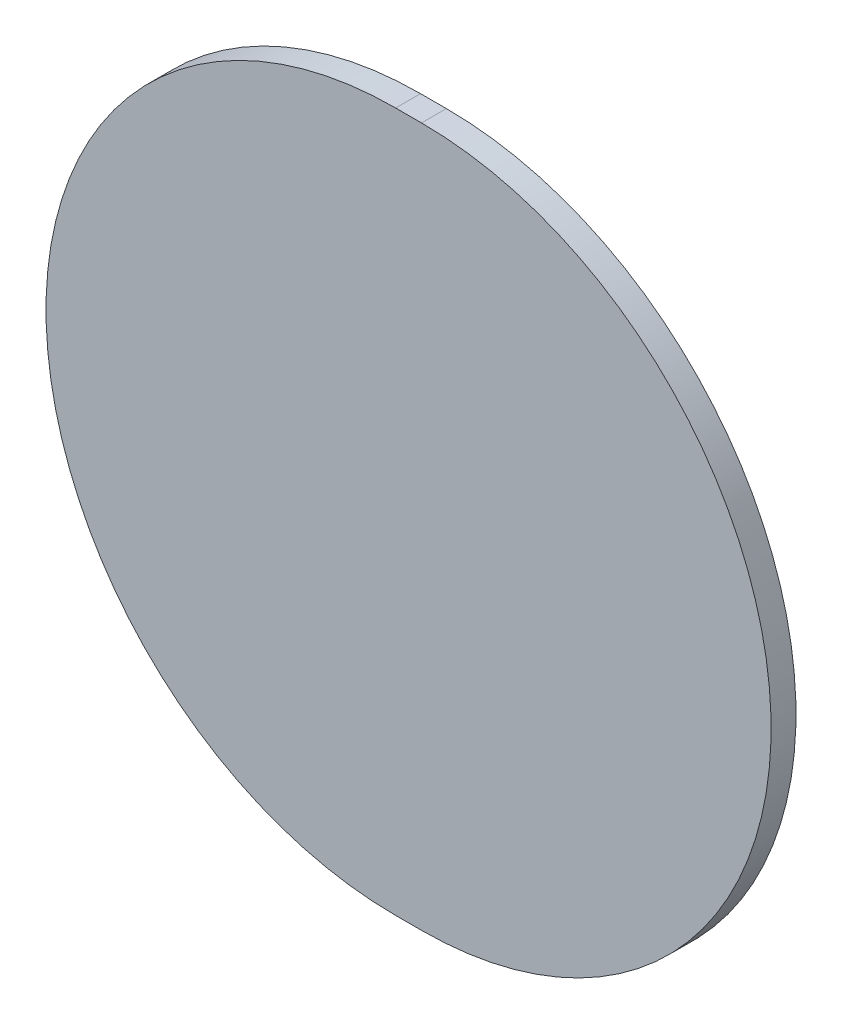
ISO-10303-21;
HEADER;
FILE_DESCRIPTION(('STEP AP214'),'2;1');
FILE_NAME('part.step','',(''),(''),'','','');
FILE_SCHEMA(('AUTOMOTIVE_DESIGN { 1 0 10303 214 1 1 1 1 }'));
ENDSEC;
DATA;
#1=APPLICATION_CONTEXT('core data for automotive mechanical design processes');
#2=APPLICATION_PROTOCOL_DEFINITION('international standard','automotive_design',2000,#1);
#3=PRODUCT_CONTEXT('',#1,'mechanical');
#4=PRODUCT('Part','Part','',(#3));
#5=PRODUCT_RELATED_PRODUCT_CATEGORY('part','',(#4));
#6=PRODUCT_DEFINITION_FORMATION('','',#4);
#7=PRODUCT_DEFINITION_CONTEXT('part definition',#1,'design');
#8=PRODUCT_DEFINITION('design','',#6,#7);
#9=PRODUCT_DEFINITION_SHAPE('','',#8);
#10=(LENGTH_UNIT() NAMED_UNIT(*) SI_UNIT(.MILLI.,.METRE.));
#11=(NAMED_UNIT(*) PLANE_ANGLE_UNIT() SI_UNIT($,.RADIAN.));
#12=(NAMED_UNIT(*) SI_UNIT($,.STERADIAN.) SOLID_ANGLE_UNIT());
#13=UNCERTAINTY_MEASURE_WITH_UNIT(LENGTH_MEASURE(1.E-05),#10,'distance_accuracy_value','');
#14=(GEOMETRIC_REPRESENTATION_CONTEXT(3) GLOBAL_UNCERTAINTY_ASSIGNED_CONTEXT((#13)) GLOBAL_UNIT_ASSIGNED_CONTEXT((#10,
#11,#12)) REPRESENTATION_CONTEXT('',''));
#15=CARTESIAN_POINT('',(0.,0.,0.));
#16=DIRECTION('',(0.,0.,1.));
#17=DIRECTION('',(1.,0.,0.));
#18=AXIS2_PLACEMENT_3D('',#15,#16,#17);
#19=CARTESIAN_POINT('',(80.93048076,80.5010582,0.));
#20=DIRECTION('',(0.,1.,0.));
#21=DIRECTION('',(1.,0.,0.));
#22=AXIS2_PLACEMENT_3D('',#19,#20,#21);
#23=PLANE('',#22);
#24=DIRECTION('',(1.,0.,0.));
#25=VECTOR('',#24,1.);
#26=CARTESIAN_POINT('',(80.93048076,80.5010582,0.03556));
#27=LINE('',#26,#25);
#28=CARTESIAN_POINT('',(80.93048076,80.5010582,0.03556));
#29=VERTEX_POINT('',#28);
#30=CARTESIAN_POINT('',(80.96738188,80.5010582,0.03556));
#31=VERTEX_POINT('',#30);
#32=EDGE_CURVE('E11',#29,#31,#27,.T.);
#33=ORIENTED_EDGE('',*,*,#32,.F.);
#34=DIRECTION('',(0.,0.,1.));
#35=VECTOR('',#34,1.);
#36=CARTESIAN_POINT('',(80.93048076,80.5010582,0.));
#37=LINE('',#36,#35);
#38=CARTESIAN_POINT('',(80.93048076,80.5010582,0.));
#39=VERTEX_POINT('',#38);
#40=EDGE_CURVE('E24',#39,#29,#37,.T.);
#41=ORIENTED_EDGE('',*,*,#40,.F.);
#42=DIRECTION('',(1.,0.,0.));
#43=VECTOR('',#42,1.);
#44=CARTESIAN_POINT('',(80.93048076,80.5010582,0.));
#45=LINE('',#44,#43);
#46=CARTESIAN_POINT('',(80.96738188,80.5010582,0.));
#47=VERTEX_POINT('',#46);
#48=EDGE_CURVE('E75',#39,#47,#45,.T.);
#49=ORIENTED_EDGE('',*,*,#48,.T.);
#50=DIRECTION('',(0.,0.,1.));
#51=VECTOR('',#50,1.);
#52=CARTESIAN_POINT('',(80.96738188,80.5010582,0.));
#53=LINE('',#52,#51);
#54=EDGE_CURVE('E37',#47,#31,#53,.T.);
#55=ORIENTED_EDGE('',*,*,#54,.T.);
#56=EDGE_LOOP('',(#33,#41,#49,#55));
#57=FACE_BOUND('',#56,.T.);
#58=ADVANCED_FACE('F17',(#57),#23,.F.);
#59=CARTESIAN_POINT('',(80.96738188,81.0010572,0.));
#60=DIRECTION('',(0.,0.,-1.));
#61=DIRECTION('',(0.,-1.,0.));
#62=AXIS2_PLACEMENT_3D('',#59,#60,#61);
#63=CYLINDRICAL_SURFACE('',#62,0.499998999999998);
#64=CARTESIAN_POINT('',(80.96738188,81.0010572,0.03556));
#65=DIRECTION('',(0.,0.,1.));
#66=DIRECTION('',(0.,-1.,0.));
#67=AXIS2_PLACEMENT_3D('',#64,#65,#66);
#68=CIRCLE('',#67,0.499998999999998);
#69=CARTESIAN_POINT('',(80.96738188,81.5010562,0.03556));
#70=VERTEX_POINT('',#69);
#71=EDGE_CURVE('E83',#31,#70,#68,.T.);
#72=ORIENTED_EDGE('',*,*,#71,.F.);
#73=ORIENTED_EDGE('',*,*,#54,.F.);
#74=CARTESIAN_POINT('',(80.96738188,81.0010572,0.));
#75=DIRECTION('',(0.,0.,1.));
#76=DIRECTION('',(0.,-1.,0.));
#77=AXIS2_PLACEMENT_3D('',#74,#75,#76);
#78=CIRCLE('',#77,0.499998999999998);
#79=CARTESIAN_POINT('',(80.96738188,81.5010562,0.));
#80=VERTEX_POINT('',#79);
#81=EDGE_CURVE('E81',#47,#80,#78,.T.);
#82=ORIENTED_EDGE('',*,*,#81,.T.);
#83=DIRECTION('',(0.,0.,1.));
#84=VECTOR('',#83,1.);
#85=CARTESIAN_POINT('',(80.96738188,81.5010562,0.));
#86=LINE('',#85,#84);
#87=EDGE_CURVE('E67',#80,#70,#86,.T.);
#88=ORIENTED_EDGE('',*,*,#87,.T.);
#89=EDGE_LOOP('',(#72,#73,#82,#88));
#90=FACE_BOUND('',#89,.T.);
#91=ADVANCED_FACE('F89',(#90),#63,.T.);
#92=CARTESIAN_POINT('',(80.96738188,81.5010562,0.));
#93=DIRECTION('',(0.,-1.,0.));
#94=DIRECTION('',(-1.,0.,0.));
#95=AXIS2_PLACEMENT_3D('',#92,#93,#94);
#96=PLANE('',#95);
#97=DIRECTION('',(-1.,0.,0.));
#98=VECTOR('',#97,1.);
#99=CARTESIAN_POINT('',(80.96738188,81.5010562,0.03556));
#100=LINE('',#99,#98);
#101=CARTESIAN_POINT('',(80.93048076,81.5010562,0.03556));
#102=VERTEX_POINT('',#101);
#103=EDGE_CURVE('E71',#70,#102,#100,.T.);
#104=ORIENTED_EDGE('',*,*,#103,.F.);
#105=ORIENTED_EDGE('',*,*,#87,.F.);
#106=DIRECTION('',(-1.,0.,0.));
#107=VECTOR('',#106,1.);
#108=CARTESIAN_POINT('',(80.96738188,81.5010562,0.));
#109=LINE('',#108,#107);
#110=CARTESIAN_POINT('',(80.93048076,81.5010562,0.));
#111=VERTEX_POINT('',#110);
#112=EDGE_CURVE('E63',#80,#111,#109,.T.);
#113=ORIENTED_EDGE('',*,*,#112,.T.);
#114=DIRECTION('',(0.,0.,1.));
#115=VECTOR('',#114,1.);
#116=CARTESIAN_POINT('',(80.93048076,81.5010562,0.));
#117=LINE('',#116,#115);
#118=EDGE_CURVE('E53',#111,#102,#117,.T.);
#119=ORIENTED_EDGE('',*,*,#118,.T.);
#120=EDGE_LOOP('',(#104,#105,#113,#119));
#121=FACE_BOUND('',#120,.T.);
#122=ADVANCED_FACE('F66',(#121),#96,.F.);
#123=CARTESIAN_POINT('',(80.93048076,81.0010572,0.));
#124=DIRECTION('',(0.,0.,-1.));
#125=DIRECTION('',(0.,1.,0.));
#126=AXIS2_PLACEMENT_3D('',#123,#124,#125);
#127=CYLINDRICAL_SURFACE('',#126,0.499999000000002);
#128=CARTESIAN_POINT('',(80.93048076,81.0010572,0.03556));
#129=DIRECTION('',(0.,0.,1.));
#130=DIRECTION('',(0.,1.,0.));
#131=AXIS2_PLACEMENT_3D('',#128,#129,#130);
#132=CIRCLE('',#131,0.499999000000002);
#133=EDGE_CURVE('E59',#102,#29,#132,.T.);
#134=ORIENTED_EDGE('',*,*,#133,.F.);
#135=ORIENTED_EDGE('',*,*,#118,.F.);
#136=CARTESIAN_POINT('',(80.93048076,81.0010572,0.));
#137=DIRECTION('',(0.,0.,1.));
#138=DIRECTION('',(0.,1.,0.));
#139=AXIS2_PLACEMENT_3D('',#136,#137,#138);
#140=CIRCLE('',#139,0.499999000000002);
#141=EDGE_CURVE('E57',#111,#39,#140,.T.);
#142=ORIENTED_EDGE('',*,*,#141,.T.);
#143=ORIENTED_EDGE('',*,*,#40,.T.);
#144=EDGE_LOOP('',(#134,#135,#142,#143));
#145=FACE_BOUND('',#144,.T.);
#146=ADVANCED_FACE('F55',(#145),#127,.T.);
#147=CARTESIAN_POINT('',(80.93048076,80.5010582,0.));
#148=DIRECTION('',(0.,0.,-1.));
#149=DIRECTION('',(-1.,0.,0.));
#150=AXIS2_PLACEMENT_3D('',#147,#148,#149);
#151=PLANE('',#150);
#152=ORIENTED_EDGE('',*,*,#141,.F.);
#153=ORIENTED_EDGE('',*,*,#112,.F.);
#154=ORIENTED_EDGE('',*,*,#81,.F.);
#155=ORIENTED_EDGE('',*,*,#48,.F.);
#156=EDGE_LOOP('',(#152,#153,#154,#155));
#157=FACE_BOUND('',#156,.T.);
#158=ADVANCED_FACE('F74',(#157),#151,.T.);
#159=CARTESIAN_POINT('',(80.93048076,80.5010582,0.03556));
#160=DIRECTION('',(0.,0.,-1.));
#161=DIRECTION('',(-1.,0.,0.));
#162=AXIS2_PLACEMENT_3D('',#159,#160,#161);
#163=PLANE('',#162);
#164=ORIENTED_EDGE('',*,*,#32,.T.);
#165=ORIENTED_EDGE('',*,*,#71,.T.);
#166=ORIENTED_EDGE('',*,*,#103,.T.);
#167=ORIENTED_EDGE('',*,*,#133,.T.);
#168=EDGE_LOOP('',(#164,#165,#166,#167));
#169=FACE_BOUND('',#168,.T.);
#170=ADVANCED_FACE('F91',(#169),#163,.F.);
#171=CLOSED_SHELL('',(#58,#91,#122,#146,#158,#170));
#172=MANIFOLD_SOLID_BREP('B1',#171);
#173=ADVANCED_BREP_SHAPE_REPRESENTATION('',(#18,#172),#14);
#174=SHAPE_DEFINITION_REPRESENTATION(#9,#173);
ENDSEC;
END-ISO-10303-21;
